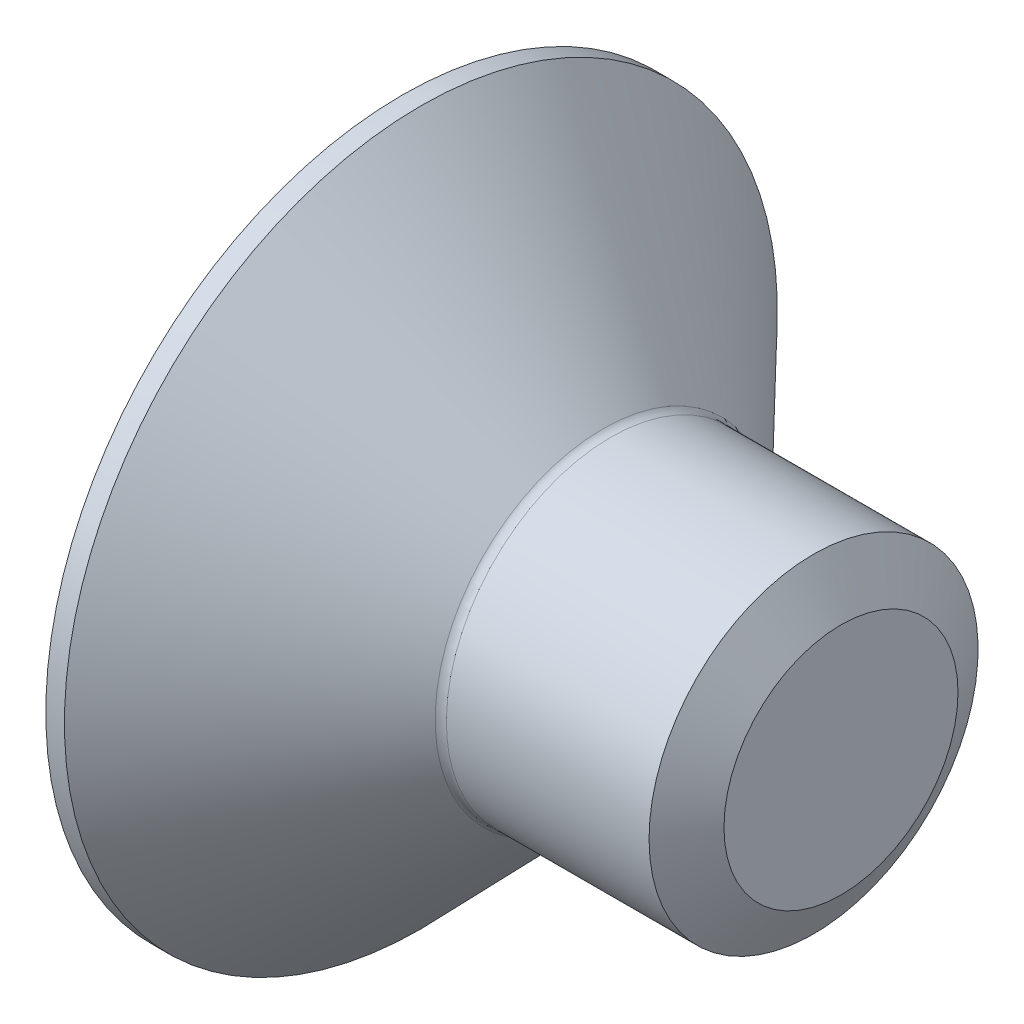
ISO-10303-21;
HEADER;
FILE_DESCRIPTION(('STEP AP214'),'2;1');
FILE_NAME('part.step','',(''),(''),'','','');
FILE_SCHEMA(('AUTOMOTIVE_DESIGN { 1 0 10303 214 1 1 1 1 }'));
ENDSEC;
DATA;
#1=APPLICATION_CONTEXT('core data for automotive mechanical design processes');
#2=APPLICATION_PROTOCOL_DEFINITION('international standard','automotive_design',2000,#1);
#3=PRODUCT_CONTEXT('',#1,'mechanical');
#4=PRODUCT('Part','Part','',(#3));
#5=PRODUCT_RELATED_PRODUCT_CATEGORY('part','',(#4));
#6=PRODUCT_DEFINITION_FORMATION('','',#4);
#7=PRODUCT_DEFINITION_CONTEXT('part definition',#1,'design');
#8=PRODUCT_DEFINITION('design','',#6,#7);
#9=PRODUCT_DEFINITION_SHAPE('','',#8);
#10=(LENGTH_UNIT() NAMED_UNIT(*) SI_UNIT(.MILLI.,.METRE.));
#11=(NAMED_UNIT(*) PLANE_ANGLE_UNIT() SI_UNIT($,.RADIAN.));
#12=(NAMED_UNIT(*) SI_UNIT($,.STERADIAN.) SOLID_ANGLE_UNIT());
#13=UNCERTAINTY_MEASURE_WITH_UNIT(LENGTH_MEASURE(1.E-05),#10,'distance_accuracy_value','');
#14=(GEOMETRIC_REPRESENTATION_CONTEXT(3) GLOBAL_UNCERTAINTY_ASSIGNED_CONTEXT((#13)) GLOBAL_UNIT_ASSIGNED_CONTEXT((#10,
#11,#12)) REPRESENTATION_CONTEXT('',''));
#15=CARTESIAN_POINT('',(0.,0.,0.));
#16=DIRECTION('',(0.,0.,1.));
#17=DIRECTION('',(1.,0.,0.));
#18=AXIS2_PLACEMENT_3D('',#15,#16,#17);
#19=CARTESIAN_POINT('',(0.,0.,0.));
#20=DIRECTION('',(1.,0.,0.));
#21=DIRECTION('',(0.,1.,0.));
#22=AXIS2_PLACEMENT_3D('',#19,#20,#21);
#23=CYLINDRICAL_SURFACE('',#22,1.5);
#24=CARTESIAN_POINT('',(-2.09755251837904,0.,0.));
#25=DIRECTION('',(1.,0.,0.));
#26=DIRECTION('',(0.,1.,0.));
#27=AXIS2_PLACEMENT_3D('',#24,#25,#26);
#28=CIRCLE('',#27,1.5);
#29=CARTESIAN_POINT('',(-2.09755251837904,1.5,0.));
#30=VERTEX_POINT('',#29);
#31=EDGE_CURVE('E123',#30,#30,#28,.T.);
#32=ORIENTED_EDGE('',*,*,#31,.T.);
#33=EDGE_LOOP('',(#32));
#34=FACE_BOUND('',#33,.T.);
#35=CARTESIAN_POINT('',(-0.25,0.,0.));
#36=DIRECTION('',(-1.,0.,0.));
#37=DIRECTION('',(0.,0.,1.));
#38=AXIS2_PLACEMENT_3D('',#35,#36,#37);
#39=CIRCLE('',#38,1.5);
#40=CARTESIAN_POINT('',(-0.25,0.,1.5));
#41=VERTEX_POINT('',#40);
#42=EDGE_CURVE('E114',#41,#41,#39,.T.);
#43=ORIENTED_EDGE('',*,*,#42,.T.);
#44=EDGE_LOOP('',(#43));
#45=FACE_BOUND('',#44,.T.);
#46=ADVANCED_FACE('F36',(#34,#45),#23,.T.);
#47=CARTESIAN_POINT('',(-4.,3.25,0.));
#48=DIRECTION('',(-1.,0.,0.));
#49=DIRECTION('',(0.,-1.,0.));
#50=AXIS2_PLACEMENT_3D('',#47,#48,#49);
#51=PLANE('',#50);
#52=CARTESIAN_POINT('',(-4.,0.,0.));
#53=DIRECTION('',(1.,0.,0.));
#54=DIRECTION('',(0.,1.,0.));
#55=AXIS2_PLACEMENT_3D('',#52,#53,#54);
#56=CIRCLE('',#55,3.25);
#57=CARTESIAN_POINT('',(-4.,3.25,0.));
#58=VERTEX_POINT('',#57);
#59=EDGE_CURVE('E206',#58,#58,#56,.T.);
#60=ORIENTED_EDGE('',*,*,#59,.F.);
#61=EDGE_LOOP('',(#60));
#62=FACE_BOUND('',#61,.T.);
#63=CARTESIAN_POINT('',(-4.,0.,0.));
#64=DIRECTION('',(-1.,0.,0.));
#65=DIRECTION('',(0.,-1.,0.));
#66=AXIS2_PLACEMENT_3D('',#63,#64,#65);
#67=CIRCLE('',#66,1.15470053837926);
#68=CARTESIAN_POINT('',(-4.,-0.577350269189633,0.999999999999996));
#69=VERTEX_POINT('',#68);
#70=CARTESIAN_POINT('',(-4.,-1.15470053837925,0.));
#71=VERTEX_POINT('',#70);
#72=EDGE_CURVE('E40',#69,#71,#67,.F.);
#73=ORIENTED_EDGE('',*,*,#72,.T.);
#74=CARTESIAN_POINT('',(-4.,-0.577350269189619,-1.));
#75=VERTEX_POINT('',#74);
#76=EDGE_CURVE('E11',#71,#75,#67,.F.);
#77=ORIENTED_EDGE('',*,*,#76,.T.);
#78=CARTESIAN_POINT('',(-4.,0.577350269189626,-1.));
#79=VERTEX_POINT('',#78);
#80=EDGE_CURVE('E45',#75,#79,#67,.F.);
#81=ORIENTED_EDGE('',*,*,#80,.T.);
#82=CARTESIAN_POINT('',(-4.,1.15470053837925,0.));
#83=VERTEX_POINT('',#82);
#84=EDGE_CURVE('E110',#79,#83,#67,.F.);
#85=ORIENTED_EDGE('',*,*,#84,.T.);
#86=CARTESIAN_POINT('',(-4.,0.,0.));
#87=DIRECTION('',(-1.,0.,0.));
#88=DIRECTION('',(0.,0.,1.));
#89=AXIS2_PLACEMENT_3D('',#86,#87,#88);
#90=CIRCLE('',#89,1.15470053837925);
#91=CARTESIAN_POINT('',(-4.,0.57735026918962,1.));
#92=VERTEX_POINT('',#91);
#93=EDGE_CURVE('E95',#92,#83,#90,.T.);
#94=ORIENTED_EDGE('',*,*,#93,.F.);
#95=EDGE_CURVE('E104',#92,#69,#67,.F.);
#96=ORIENTED_EDGE('',*,*,#95,.T.);
#97=EDGE_LOOP('',(#73,#77,#81,#85,#94,#96));
#98=FACE_BOUND('',#97,.T.);
#99=ADVANCED_FACE('F111',(#62,#98),#51,.T.);
#100=CARTESIAN_POINT('',(0.,0.,0.));
#101=DIRECTION('',(1.,0.,0.));
#102=DIRECTION('',(0.,1.,0.));
#103=AXIS2_PLACEMENT_3D('',#100,#101,#102);
#104=CYLINDRICAL_SURFACE('',#103,3.25);
#105=ORIENTED_EDGE('',*,*,#59,.T.);
#106=EDGE_LOOP('',(#105));
#107=FACE_BOUND('',#106,.T.);
#108=CARTESIAN_POINT('',(-3.82995535591237,0.,0.));
#109=DIRECTION('',(1.,0.,0.));
#110=DIRECTION('',(0.,1.,0.));
#111=AXIS2_PLACEMENT_3D('',#108,#109,#110);
#112=CIRCLE('',#111,3.25);
#113=CARTESIAN_POINT('',(-3.82995535591237,3.25,0.));
#114=VERTEX_POINT('',#113);
#115=EDGE_CURVE('E208',#114,#114,#112,.T.);
#116=ORIENTED_EDGE('',*,*,#115,.F.);
#117=EDGE_LOOP('',(#116));
#118=FACE_BOUND('',#117,.T.);
#119=ADVANCED_FACE('F196',(#107,#118),#104,.T.);
#120=CARTESIAN_POINT('',(-2.1694864984129,0.,0.));
#121=DIRECTION('',(-1.,0.,0.));
#122=DIRECTION('',(0.,-1.,0.));
#123=AXIS2_PLACEMENT_3D('',#120,#121,#122);
#124=CONICAL_SURFACE('',#123,1.5305341629541,0.802851455917393);
#125=ORIENTED_EDGE('',*,*,#115,.T.);
#126=EDGE_LOOP('',(#125));
#127=FACE_BOUND('',#126,.T.);
#128=CARTESIAN_POINT('',(-2.1694864984129,0.,0.));
#129=DIRECTION('',(1.,0.,0.));
#130=DIRECTION('',(0.,1.,0.));
#131=AXIS2_PLACEMENT_3D('',#128,#129,#130);
#132=CIRCLE('',#131,1.5305341629541);
#133=CARTESIAN_POINT('',(-2.1694864984129,1.5305341629541,0.));
#134=VERTEX_POINT('',#133);
#135=EDGE_CURVE('E212',#134,#134,#132,.T.);
#136=ORIENTED_EDGE('',*,*,#135,.F.);
#137=EDGE_LOOP('',(#136));
#138=FACE_BOUND('',#137,.T.);
#139=ADVANCED_FACE('F192',(#127,#138),#124,.T.);
#140=CARTESIAN_POINT('',(-2.09755251837904,0.,0.));
#141=DIRECTION('',(1.,0.,0.));
#142=DIRECTION('',(0.,1.,0.));
#143=AXIS2_PLACEMENT_3D('',#140,#141,#142);
#144=TOROIDAL_SURFACE('',#143,1.6,0.1);
#145=ORIENTED_EDGE('',*,*,#135,.T.);
#146=EDGE_LOOP('',(#145));
#147=FACE_BOUND('',#146,.T.);
#148=ORIENTED_EDGE('',*,*,#31,.F.);
#149=EDGE_LOOP('',(#148));
#150=FACE_BOUND('',#149,.T.);
#151=ADVANCED_FACE('F188',(#147,#150),#144,.F.);
#152=CARTESIAN_POINT('',(-3.67,0.,0.));
#153=DIRECTION('',(-1.,0.,0.));
#154=DIRECTION('',(0.,0.,1.));
#155=AXIS2_PLACEMENT_3D('',#152,#153,#154);
#156=CONICAL_SURFACE('',#155,0.,1.2924281638629);
#157=CARTESIAN_POINT('',(-4.0000330049495,-0.577234799135788,1.0002));
#158=CARTESIAN_POINT('',(-3.99317677231321,-0.601209328784403,0.958674896561032));
#159=CARTESIAN_POINT('',(-3.986950249306,-0.625233209733956,0.917064314161421));
#160=CARTESIAN_POINT('',(-3.97600820198551,-0.673377505205147,0.83367594831071));
#161=CARTESIAN_POINT('',(-3.97129338172424,-0.697497959424798,0.791898096100636));
#162=CARTESIAN_POINT('',(-3.9636556441477,-0.745669161891495,0.70846312596663));
#163=CARTESIAN_POINT('',(-3.96072237456089,-0.769719488656232,0.66680673807147));
#164=CARTESIAN_POINT('',(-3.95678895886859,-0.817855017501817,0.583433556461721));
#165=CARTESIAN_POINT('',(-3.95578838324886,-0.841940210643128,0.54171677823086));
#166=CARTESIAN_POINT('',(-3.95578838324886,-0.890110596925751,0.458283221769139));
#167=CARTESIAN_POINT('',(-3.95678895886859,-0.914195790067062,0.416566443538279));
#168=CARTESIAN_POINT('',(-3.96072237456089,-0.962331318912646,0.333193261928529));
#169=CARTESIAN_POINT('',(-3.9636556441477,-0.986381645677384,0.29153687403337));
#170=CARTESIAN_POINT('',(-3.97129338172424,-1.03455284814408,0.208101903899364));
#171=CARTESIAN_POINT('',(-3.97600820198551,-1.05867330236373,0.166324051689289));
#172=CARTESIAN_POINT('',(-3.986950249306,-1.10681759783492,0.0829356858385786));
#173=CARTESIAN_POINT('',(-3.9931767723132,-1.13084147878447,0.0413251034389671));
#174=CARTESIAN_POINT('',(-4.0000330049495,-1.15481600843309,-0.000200000000000163));
#175=B_SPLINE_CURVE_WITH_KNOTS('',3,(#157,#158,#159,#160,#161,#162,#163,#164,#165,#166,#167,
#168,#169,#170,#171,#172,#173,#174),.UNSPECIFIED.,.F.,.F.,(4,2,2,2,2,2,2,2,4),(0.,
0.145319064827825,0.290705711767534,0.435239252261502,0.579740668498364,0.724242084735225,
0.868775625229193,1.0141622721689,1.15948133699673),.UNSPECIFIED.);
#176=EDGE_CURVE('E129',#69,#71,#175,.T.);
#177=ORIENTED_EDGE('',*,*,#176,.T.);
#178=ORIENTED_EDGE('',*,*,#72,.F.);
#179=EDGE_LOOP('',(#177,#178));
#180=FACE_BOUND('',#179,.T.);
#181=ADVANCED_FACE('F191',(#180),#156,.F.);
#182=CARTESIAN_POINT('',(-4.18642012479891,-1.50507658562174,1.));
#183=CARTESIAN_POINT('',(-4.17568053389836,-1.45995191683151,1.));
#184=CARTESIAN_POINT('',(-4.1650772555009,-1.41479478404147,1.));
#185=CARTESIAN_POINT('',(-4.14421246509078,-1.32439927872502,1.));
#186=CARTESIAN_POINT('',(-4.13395097066938,-1.27916090214299,1.));
#187=CARTESIAN_POINT('',(-4.10376110485824,-1.14320091952673,1.));
#188=CARTESIAN_POINT('',(-4.08445269282589,-1.0523395057026,1.));
#189=CARTESIAN_POINT('',(-4.0485427680109,-0.871021733651419,1.));
#190=CARTESIAN_POINT('',(-4.03191600726561,-0.780570478060274,1.));
#191=CARTESIAN_POINT('',(-4.00245938977244,-0.599053834032337,1.));
#192=CARTESIAN_POINT('',(-3.98962864404707,-0.507988594500085,1.));
#193=CARTESIAN_POINT('',(-3.96943375174607,-0.32401701013366,1.));
#194=CARTESIAN_POINT('',(-3.96214218519738,-0.231102062710143,1.));
#195=CARTESIAN_POINT('',(-3.95667782512395,-0.0915430747170623,1.));
#196=CARTESIAN_POINT('',(-3.9557682159605,-0.0450005144934814,1.));
#197=CARTESIAN_POINT('',(-3.95580922979905,0.0480838901527622,1.));
#198=CARTESIAN_POINT('',(-3.95675985710569,0.0946257345735194,1.));
#199=CARTESIAN_POINT('',(-3.96235911230975,0.234573783926051,1.));
#200=CARTESIAN_POINT('',(-3.96977149970246,0.327875024932963,1.));
#201=CARTESIAN_POINT('',(-3.99036481799359,0.513866327853431,1.));
#202=CARTESIAN_POINT('',(-4.00355054731467,0.60655581613127,1.));
#203=CARTESIAN_POINT('',(-4.03433027338347,0.7945597970276,1.));
#204=CARTESIAN_POINT('',(-4.05206417336317,0.889850634542145,1.));
#205=CARTESIAN_POINT('',(-4.09017928884159,1.07990716554416,1.));
#206=CARTESIAN_POINT('',(-4.11056098996145,1.17467275936659,1.));
#207=CARTESIAN_POINT('',(-4.15303020702755,1.36384761434311,1.));
#208=CARTESIAN_POINT('',(-4.17511824931273,1.45825675605089,1.));
#209=CARTESIAN_POINT('',(-4.22042048843015,1.64680497415505,1.));
#210=CARTESIAN_POINT('',(-4.24363471263918,1.74094404392717,1.));
#211=CARTESIAN_POINT('',(-4.29049807328423,1.92768913293957,1.));
#212=CARTESIAN_POINT('',(-4.31413631318398,2.02029789764918,1.));
#213=CARTESIAN_POINT('',(-4.36194659114886,2.20537976707471,1.));
#214=CARTESIAN_POINT('',(-4.38611864310246,2.2978528681941,1.));
#215=CARTESIAN_POINT('',(-4.43481362957481,2.48255351818147,1.));
#216=CARTESIAN_POINT('',(-4.45933596375947,2.57478122564271,1.));
#217=CARTESIAN_POINT('',(-4.50867632184139,2.7591535456386,1.));
#218=CARTESIAN_POINT('',(-4.53349433367616,2.8512981613992,1.));
#219=CARTESIAN_POINT('',(-4.55841535287488,2.94341459729474,1.));
#220=B_SPLINE_CURVE_WITH_KNOTS('',3,(#182,#183,#184,#185,#186,#187,#188,#189,#190,#191,#192,
#193,#194,#195,#196,#197,#198,#199,#200,#201,#202,#203,#204,#205,#206,#207,#208,#209,#210,#211,
#212,#213,#214,#215,#216,#217,#218,#219),.UNSPECIFIED.,.F.,.F.,(4,2,2,2,2,2,2,2,2,2,2,2,2,2,2,2,
2,2,4),(0.,0.139154753232828,0.278316657587893,0.556964604480121,0.83281288176632,
1.10859650773445,1.38793420964474,1.52755398880046,1.66717409104072,1.94769382621527,
2.22844715485888,2.519169414303,2.80994506926728,3.10081077796332,3.39168356097394,
3.67841536084619,3.96515462957441,4.25145053495921,4.53773480030589),.UNSPECIFIED.);
#221=EDGE_CURVE('E100',#92,#69,#220,.F.);
#222=ORIENTED_EDGE('',*,*,#221,.T.);
#223=ORIENTED_EDGE('',*,*,#95,.F.);
#224=EDGE_LOOP('',(#222,#223));
#225=FACE_BOUND('',#224,.T.);
#226=ADVANCED_FACE('F105',(#225),#156,.F.);
#227=CARTESIAN_POINT('',(-4.0000330049495,1.15481600843309,-0.000199999999999794));
#228=CARTESIAN_POINT('',(-3.9931767723132,1.13084147878447,0.0413251034389676));
#229=CARTESIAN_POINT('',(-3.986950249306,1.10681759783492,0.082935685838579));
#230=CARTESIAN_POINT('',(-3.97600820198551,1.05867330236373,0.166324051689289));
#231=CARTESIAN_POINT('',(-3.97129338172424,1.03455284814408,0.208101903899364));
#232=CARTESIAN_POINT('',(-3.9636556441477,0.986381645677383,0.29153687403337));
#233=CARTESIAN_POINT('',(-3.96072237456089,0.962331318912645,0.33319326192853));
#234=CARTESIAN_POINT('',(-3.95678895886859,0.914195790067061,0.416566443538279));
#235=CARTESIAN_POINT('',(-3.95578838324886,0.89011059692575,0.45828322176914));
#236=CARTESIAN_POINT('',(-3.95578838324886,0.841940210643127,0.54171677823086));
#237=CARTESIAN_POINT('',(-3.95678895886859,0.817855017501816,0.583433556461721));
#238=CARTESIAN_POINT('',(-3.96072237456089,0.769719488656232,0.66680673807147));
#239=CARTESIAN_POINT('',(-3.9636556441477,0.745669161891494,0.70846312596663));
#240=CARTESIAN_POINT('',(-3.97129338172424,0.697497959424797,0.791898096100636));
#241=CARTESIAN_POINT('',(-3.97600820198551,0.673377505205146,0.83367594831071));
#242=CARTESIAN_POINT('',(-3.986950249306,0.625233209733955,0.917064314161421));
#243=CARTESIAN_POINT('',(-3.99317677231321,0.601209328784402,0.958674896561032));
#244=CARTESIAN_POINT('',(-4.0000330049495,0.577234799135788,1.0002));
#245=B_SPLINE_CURVE_WITH_KNOTS('',3,(#227,#228,#229,#230,#231,#232,#233,#234,#235,#236,#237,
#238,#239,#240,#241,#242,#243,#244),.UNSPECIFIED.,.F.,.F.,(4,2,2,2,2,2,2,2,4),(0.,
0.145319064827825,0.290705711767534,0.435239252261502,0.579740668498363,0.724242084735225,
0.868775625229193,1.0141622721689,1.15948133699673),.UNSPECIFIED.);
#246=EDGE_CURVE('E91',#83,#92,#245,.T.);
#247=ORIENTED_EDGE('',*,*,#246,.T.);
#248=ORIENTED_EDGE('',*,*,#93,.T.);
#249=EDGE_LOOP('',(#247,#248));
#250=FACE_BOUND('',#249,.T.);
#251=ADVANCED_FACE('F93',(#250),#156,.F.);
#252=CARTESIAN_POINT('',(-4.0000330049495,0.577234799135788,-1.0002));
#253=CARTESIAN_POINT('',(-3.9931767723132,0.601209328784402,-0.958674896561033));
#254=CARTESIAN_POINT('',(-3.986950249306,0.625233209733955,-0.917064314161421));
#255=CARTESIAN_POINT('',(-3.97600820198551,0.673377505205146,-0.83367594831071));
#256=CARTESIAN_POINT('',(-3.97129338172424,0.697497959424797,-0.791898096100636));
#257=CARTESIAN_POINT('',(-3.9636556441477,0.745669161891494,-0.70846312596663));
#258=CARTESIAN_POINT('',(-3.96072237456089,0.769719488656232,-0.66680673807147));
#259=CARTESIAN_POINT('',(-3.95678895886859,0.817855017501816,-0.583433556461721));
#260=CARTESIAN_POINT('',(-3.95578838324886,0.841940210643127,-0.54171677823086));
#261=CARTESIAN_POINT('',(-3.95578838324886,0.890110596925749,-0.458283221769139));
#262=CARTESIAN_POINT('',(-3.95678895886859,0.914195790067061,-0.416566443538279));
#263=CARTESIAN_POINT('',(-3.96072237456089,0.962331318912645,-0.333193261928529));
#264=CARTESIAN_POINT('',(-3.9636556441477,0.986381645677383,-0.29153687403337));
#265=CARTESIAN_POINT('',(-3.97129338172424,1.03455284814408,-0.208101903899363));
#266=CARTESIAN_POINT('',(-3.97600820198551,1.05867330236373,-0.166324051689289));
#267=CARTESIAN_POINT('',(-3.986950249306,1.10681759783492,-0.0829356858385785));
#268=CARTESIAN_POINT('',(-3.9931767723132,1.13084147878447,-0.041325103438967));
#269=CARTESIAN_POINT('',(-4.0000330049495,1.15481600843309,0.000200000000000296));
#270=B_SPLINE_CURVE_WITH_KNOTS('',3,(#252,#253,#254,#255,#256,#257,#258,#259,#260,#261,#262,
#263,#264,#265,#266,#267,#268,#269),.UNSPECIFIED.,.F.,.F.,(4,2,2,2,2,2,2,2,4),(0.,
0.145319064827825,0.290705711767534,0.435239252261503,0.579740668498364,0.724242084735225,
0.868775625229193,1.0141622721689,1.15948133699673),.UNSPECIFIED.);
#271=EDGE_CURVE('E113',#79,#83,#270,.T.);
#272=ORIENTED_EDGE('',*,*,#271,.T.);
#273=ORIENTED_EDGE('',*,*,#84,.F.);
#274=EDGE_LOOP('',(#272,#273));
#275=FACE_BOUND('',#274,.T.);
#276=ADVANCED_FACE('F282',(#275),#156,.F.);
#277=CARTESIAN_POINT('',(-4.18642012479891,-1.50507658562174,-1.));
#278=CARTESIAN_POINT('',(-4.17568053389836,-1.45995191683151,-1.));
#279=CARTESIAN_POINT('',(-4.1650772555009,-1.41479478404147,-1.));
#280=CARTESIAN_POINT('',(-4.14421246509078,-1.32439927872502,-1.));
#281=CARTESIAN_POINT('',(-4.13395097066938,-1.27916090214299,-1.));
#282=CARTESIAN_POINT('',(-4.10376110485824,-1.14320091952673,-1.));
#283=CARTESIAN_POINT('',(-4.08445269282589,-1.0523395057026,-1.));
#284=CARTESIAN_POINT('',(-4.0485427680109,-0.871021733651419,-1.));
#285=CARTESIAN_POINT('',(-4.03191600726561,-0.780570478060274,-1.));
#286=CARTESIAN_POINT('',(-4.00245938977244,-0.599053834032337,-1.));
#287=CARTESIAN_POINT('',(-3.98962864404707,-0.507988594500085,-1.));
#288=CARTESIAN_POINT('',(-3.96943375174607,-0.32401701013366,-1.));
#289=CARTESIAN_POINT('',(-3.96214218519738,-0.231102062710142,-1.));
#290=CARTESIAN_POINT('',(-3.95667782512395,-0.091543074717062,-1.));
#291=CARTESIAN_POINT('',(-3.9557682159605,-0.0450005144934812,-1.));
#292=CARTESIAN_POINT('',(-3.95580922979905,0.0480838901527625,-1.));
#293=CARTESIAN_POINT('',(-3.95675985710569,0.0946257345735197,-1.));
#294=CARTESIAN_POINT('',(-3.96235911230975,0.234573783926051,-1.));
#295=CARTESIAN_POINT('',(-3.96977149970246,0.327875024932964,-1.));
#296=CARTESIAN_POINT('',(-3.99036481799359,0.513866327853432,-1.));
#297=CARTESIAN_POINT('',(-4.00355054731467,0.606555816131271,-1.));
#298=CARTESIAN_POINT('',(-4.03433027338347,0.7945597970276,-1.));
#299=CARTESIAN_POINT('',(-4.05206417336317,0.889850634542145,-1.));
#300=CARTESIAN_POINT('',(-4.09017928884159,1.07990716554416,-1.));
#301=CARTESIAN_POINT('',(-4.11056098996145,1.17467275936659,-1.));
#302=CARTESIAN_POINT('',(-4.15303020702755,1.36384761434311,-1.));
#303=CARTESIAN_POINT('',(-4.17511824931273,1.45825675605089,-1.));
#304=CARTESIAN_POINT('',(-4.22042048843015,1.64680497415505,-1.));
#305=CARTESIAN_POINT('',(-4.24363471263918,1.74094404392717,-1.));
#306=CARTESIAN_POINT('',(-4.29049807328423,1.92768913293957,-1.));
#307=CARTESIAN_POINT('',(-4.31413631318398,2.02029789764918,-1.));
#308=CARTESIAN_POINT('',(-4.36194659114886,2.20537976707471,-1.));
#309=CARTESIAN_POINT('',(-4.38611864310246,2.2978528681941,-1.));
#310=CARTESIAN_POINT('',(-4.43481362957481,2.48255351818147,-1.));
#311=CARTESIAN_POINT('',(-4.45933596375947,2.57478122564271,-1.));
#312=CARTESIAN_POINT('',(-4.50867632184139,2.75915354563859,-1.));
#313=CARTESIAN_POINT('',(-4.53349433367616,2.8512981613992,-1.));
#314=CARTESIAN_POINT('',(-4.55841535287488,2.94341459729474,-1.));
#315=B_SPLINE_CURVE_WITH_KNOTS('',3,(#277,#278,#279,#280,#281,#282,#283,#284,#285,#286,#287,
#288,#289,#290,#291,#292,#293,#294,#295,#296,#297,#298,#299,#300,#301,#302,#303,#304,#305,#306,
#307,#308,#309,#310,#311,#312,#313,#314),.UNSPECIFIED.,.F.,.F.,(4,2,2,2,2,2,2,2,2,2,2,2,2,2,2,2,
2,2,4),(0.,0.139154753232828,0.278316657587893,0.556964604480121,0.83281288176632,
1.10859650773445,1.38793420964474,1.52755398880046,1.66717409104072,1.94769382621527,
2.22844715485888,2.519169414303,2.80994506926728,3.10081077796332,3.39168356097394,
3.67841536084619,3.96515462957441,4.25145053495921,4.53773480030589),.UNSPECIFIED.);
#316=EDGE_CURVE('E241',#75,#79,#315,.T.);
#317=ORIENTED_EDGE('',*,*,#316,.T.);
#318=ORIENTED_EDGE('',*,*,#80,.F.);
#319=EDGE_LOOP('',(#317,#318));
#320=FACE_BOUND('',#319,.T.);
#321=ADVANCED_FACE('F269',(#320),#156,.F.);
#322=CARTESIAN_POINT('',(-4.0000330049495,-1.15481600843309,0.000199999999999856));
#323=CARTESIAN_POINT('',(-3.9931767723132,-1.13084147878447,-0.0413251034389675));
#324=CARTESIAN_POINT('',(-3.986950249306,-1.10681759783492,-0.082935685838579));
#325=CARTESIAN_POINT('',(-3.97600820198551,-1.05867330236373,-0.166324051689289));
#326=CARTESIAN_POINT('',(-3.97129338172424,-1.03455284814408,-0.208101903899364));
#327=CARTESIAN_POINT('',(-3.9636556441477,-0.986381645677384,-0.29153687403337));
#328=CARTESIAN_POINT('',(-3.96072237456089,-0.962331318912646,-0.33319326192853));
#329=CARTESIAN_POINT('',(-3.95678895886859,-0.914195790067061,-0.416566443538279));
#330=CARTESIAN_POINT('',(-3.95578838324886,-0.89011059692575,-0.45828322176914));
#331=CARTESIAN_POINT('',(-3.95578838324886,-0.841940210643128,-0.54171677823086));
#332=CARTESIAN_POINT('',(-3.95678895886859,-0.817855017501817,-0.583433556461721));
#333=CARTESIAN_POINT('',(-3.96072237456089,-0.769719488656232,-0.66680673807147));
#334=CARTESIAN_POINT('',(-3.9636556441477,-0.745669161891494,-0.70846312596663));
#335=CARTESIAN_POINT('',(-3.97129338172424,-0.697497959424797,-0.791898096100636));
#336=CARTESIAN_POINT('',(-3.97600820198551,-0.673377505205147,-0.833675948310711));
#337=CARTESIAN_POINT('',(-3.986950249306,-0.625233209733956,-0.917064314161421));
#338=CARTESIAN_POINT('',(-3.9931767723132,-0.601209328784403,-0.958674896561033));
#339=CARTESIAN_POINT('',(-4.0000330049495,-0.577234799135788,-1.0002));
#340=B_SPLINE_CURVE_WITH_KNOTS('',3,(#322,#323,#324,#325,#326,#327,#328,#329,#330,#331,#332,
#333,#334,#335,#336,#337,#338,#339),.UNSPECIFIED.,.F.,.F.,(4,2,2,2,2,2,2,2,4),(0.,
0.145319064827825,0.290705711767534,0.435239252261502,0.579740668498364,0.724242084735225,
0.868775625229193,1.0141622721689,1.15948133699673),.UNSPECIFIED.);
#341=EDGE_CURVE('E131',#71,#75,#340,.T.);
#342=ORIENTED_EDGE('',*,*,#341,.T.);
#343=ORIENTED_EDGE('',*,*,#76,.F.);
#344=EDGE_LOOP('',(#342,#343));
#345=FACE_BOUND('',#344,.T.);
#346=ADVANCED_FACE('F272',(#345),#156,.F.);
#347=CARTESIAN_POINT('',(-2.9,0.,0.));
#348=DIRECTION('',(-1.,0.,0.));
#349=DIRECTION('',(0.,0.,1.));
#350=AXIS2_PLACEMENT_3D('',#347,#348,#349);
#351=CONICAL_SURFACE('',#350,1.15470053837925,1.0471975511966);
#352=CARTESIAN_POINT('',(-2.23333333333334,0.,0.));
#353=VERTEX_POINT('',#352);
#354=VERTEX_LOOP('',#353);
#355=FACE_BOUND('',#354,.T.);
#356=CARTESIAN_POINT('',(-3.27183528873946,-1.49514512143374,1.));
#357=CARTESIAN_POINT('',(-3.25111502079343,-1.4519612611533,1.));
#358=CARTESIAN_POINT('',(-3.23061367234946,-1.40867282404236,1.));
#359=CARTESIAN_POINT('',(-3.1901634335246,-1.32182947914248,1.));
#360=CARTESIAN_POINT('',(-3.17021464256729,-1.27827452509756,1.));
#361=CARTESIAN_POINT('',(-3.11114515483648,-1.14662339890625,1.));
#362=CARTESIAN_POINT('',(-3.07305252653304,-1.05805724149108,1.));
#363=CARTESIAN_POINT('',(-3.00024582070057,-0.876833003172497,1.));
#364=CARTESIAN_POINT('',(-2.96564584045392,-0.784128452056495,1.));
#365=CARTESIAN_POINT('',(-2.90407347381845,-0.596331746532131,1.));
#366=CARTESIAN_POINT('',(-2.87708128484785,-0.501246505541256,1.));
#367=CARTESIAN_POINT('',(-2.84577577003502,-0.356699986452703,1.));
#368=CARTESIAN_POINT('',(-2.83687509854699,-0.308244163171709,1.));
#369=CARTESIAN_POINT('',(-2.82274243175691,-0.210788870695443,1.));
#370=CARTESIAN_POINT('',(-2.81751018853518,-0.161789438465742,1.));
#371=CARTESIAN_POINT('',(-2.81119898098177,-0.0641060489970661,1.));
#372=CARTESIAN_POINT('',(-2.8100710050111,-0.015425346126977,1.));
#373=CARTESIAN_POINT('',(-2.81193297830514,0.0818553564032753,1.));
#374=CARTESIAN_POINT('',(-2.81492318255361,0.130455350879702,1.));
#375=CARTESIAN_POINT('',(-2.8271183217293,0.250369589613778,1.));
#376=CARTESIAN_POINT('',(-2.83860856098489,0.321451919115028,1.));
#377=CARTESIAN_POINT('',(-2.86824031739763,0.462229038490168,1.));
#378=CARTESIAN_POINT('',(-2.88638985094493,0.531922048861734,1.));
#379=CARTESIAN_POINT('',(-2.92786972268664,0.671415729806807,1.));
#380=CARTESIAN_POINT('',(-2.95130716830693,0.741183729418072,1.));
#381=CARTESIAN_POINT('',(-3.00156448824641,0.87943831939629,1.));
#382=CARTESIAN_POINT('',(-3.02838317523047,0.947925349932562,1.));
#383=CARTESIAN_POINT('',(-3.10005391547339,1.12214515906645,1.));
#384=CARTESIAN_POINT('',(-3.14657230519898,1.22718574040678,1.));
#385=CARTESIAN_POINT('',(-3.24287692224798,1.43575968104558,1.));
#386=CARTESIAN_POINT('',(-3.29266398782223,1.53929264533348,1.));
#387=CARTESIAN_POINT('',(-3.39433644453463,1.74546702338822,1.));
#388=CARTESIAN_POINT('',(-3.44622418186697,1.84810727553999,1.));
#389=CARTESIAN_POINT('',(-3.55133836883522,2.05270058021726,1.));
#390=CARTESIAN_POINT('',(-3.60456486267233,2.15465360991172,1.));
#391=CARTESIAN_POINT('',(-3.7068669169112,2.34846553091283,1.));
#392=CARTESIAN_POINT('',(-3.75585965896403,2.44036823161571,1.));
#393=CARTESIAN_POINT('',(-3.8544031328282,2.623877990053,1.));
#394=CARTESIAN_POINT('',(-3.90395388528948,2.71548503668387,1.));
#395=CARTESIAN_POINT('',(-4.00334710767982,2.89823865557593,1.));
#396=CARTESIAN_POINT('',(-4.053188515041,2.98938580641155,1.));
#397=CARTESIAN_POINT('',(-4.15319572337611,3.17149583112622,1.));
#398=CARTESIAN_POINT('',(-4.20336150723714,3.26245871439935,1.));
#399=CARTESIAN_POINT('',(-4.25364621220496,3.35335539208176,1.));
#400=B_SPLINE_CURVE_WITH_KNOTS('',3,(#356,#357,#358,#359,#360,#361,#362,#363,#364,#365,#366,
#367,#368,#369,#370,#371,#372,#373,#374,#375,#376,#377,#378,#379,#380,#381,#382,#383,#384,#385,
#386,#387,#388,#389,#390,#391,#392,#393,#394,#395,#396,#397,#398,#399),.UNSPECIFIED.,.F.,.F.,(4,
2,2,2,2,2,2,2,2,2,2,2,2,2,2,2,2,2,2,2,2,4),(0.,0.143690341820649,0.287406372566272,
0.576560332877491,0.873259488934031,1.16917907000006,1.31686338831957,1.46453772487642,
1.61044269221659,1.75635669390452,1.97192533331898,2.18775432802313,2.40842600301165,
2.62902040304935,2.97355048126458,3.31816926186283,3.66318417395131,4.00821049225242,
4.32064609598596,4.63309330006988,4.9447457824876,5.2563819552864),.UNSPECIFIED.);
#401=CARTESIAN_POINT('',(-2.9,-0.577350269189626,1.));
#402=VERTEX_POINT('',#401);
#403=CARTESIAN_POINT('',(-2.9,0.577350269189626,1.));
#404=VERTEX_POINT('',#403);
#405=EDGE_CURVE('E160',#402,#404,#400,.T.);
#406=ORIENTED_EDGE('',*,*,#405,.T.);
#407=CARTESIAN_POINT('',(-2.90006667666566,0.577234799135788,1.0002));
#408=CARTESIAN_POINT('',(-2.88540897364914,0.602607795820547,0.95625268060172));
#409=CARTESIAN_POINT('',(-2.87207772362089,0.628199807531657,0.911926016050179));
#410=CARTESIAN_POINT('',(-2.84880650762345,0.679827098330831,0.822504925328878));
#411=CARTESIAN_POINT('',(-2.83887477654978,0.705863295614158,0.777408908798268));
#412=CARTESIAN_POINT('',(-2.82341269488208,0.757612978088367,0.687775829477381));
#413=CARTESIAN_POINT('',(-2.81777946809895,0.783318495222183,0.64325256776678));
#414=CARTESIAN_POINT('',(-2.81105128864025,0.834850648373671,0.553996260284983));
#415=CARTESIAN_POINT('',(-2.80995076792166,0.860677096749781,0.509263539518505));
#416=CARTESIAN_POINT('',(-2.81222505229814,0.908946264126689,0.425658889182653));
#417=CARTESIAN_POINT('',(-2.81504143886341,0.931396163287557,0.386774523211234));
#418=CARTESIAN_POINT('',(-2.82397245021735,0.976149681982093,0.309259155014814));
#419=CARTESIAN_POINT('',(-2.8300901337543,0.998453146411451,0.270628421438361));
#420=CARTESIAN_POINT('',(-2.84538572572582,1.04329913914046,0.192952883515855));
#421=CARTESIAN_POINT('',(-2.85462855216896,1.0658359836813,0.153917923728832));
#422=CARTESIAN_POINT('',(-2.87560684575553,1.11057330008463,0.076430618723988));
#423=CARTESIAN_POINT('',(-2.88733737513366,1.13277434629517,0.0379772787061408));
#424=CARTESIAN_POINT('',(-2.90006667666566,1.15481600843309,-0.000199999999999799));
#425=B_SPLINE_CURVE_WITH_KNOTS('',3,(#407,#408,#409,#410,#411,#412,#413,#414,#415,#416,#417,
#418,#419,#420,#421,#422,#423,#424),.UNSPECIFIED.,.F.,.F.,(4,2,2,2,2,2,2,2,4),(0.,
0.158523820030115,0.317428970089342,0.472400167924633,0.627180939971648,0.762016584872711,
0.896977373984233,1.03493410168667,1.17261952416172),.UNSPECIFIED.);
#426=CARTESIAN_POINT('',(-2.9,1.15470053837925,0.));
#427=VERTEX_POINT('',#426);
#428=EDGE_CURVE('E120',#404,#427,#425,.T.);
#429=ORIENTED_EDGE('',*,*,#428,.T.);
#430=CARTESIAN_POINT('',(-2.90006667666566,1.15481600843309,0.000200000000000246));
#431=CARTESIAN_POINT('',(-2.88540897364914,1.12944301174833,-0.0437473193982797));
#432=CARTESIAN_POINT('',(-2.87207772362089,1.10385100003722,-0.08807398394982));
#433=CARTESIAN_POINT('',(-2.84880650762345,1.05222370923805,-0.177495074671122));
#434=CARTESIAN_POINT('',(-2.83887477654978,1.02618751195472,-0.222591091201731));
#435=CARTESIAN_POINT('',(-2.82341269488208,0.97443782948051,-0.312224170522618));
#436=CARTESIAN_POINT('',(-2.81777946809895,0.948732312346694,-0.356747432233219));
#437=CARTESIAN_POINT('',(-2.81105128864025,0.897200159195206,-0.446003739715017));
#438=CARTESIAN_POINT('',(-2.80995076792166,0.871373710819097,-0.490736460481494));
#439=CARTESIAN_POINT('',(-2.81222505229814,0.823104543442188,-0.574341110817346));
#440=CARTESIAN_POINT('',(-2.81504143886341,0.800654644281321,-0.613225476788766));
#441=CARTESIAN_POINT('',(-2.82397245021735,0.755901125586785,-0.690740844985186));
#442=CARTESIAN_POINT('',(-2.8300901337543,0.733597661157427,-0.729371578561639));
#443=CARTESIAN_POINT('',(-2.84538572572582,0.688751668428419,-0.807047116484145));
#444=CARTESIAN_POINT('',(-2.85462855216896,0.666214823887575,-0.846082076271167));
#445=CARTESIAN_POINT('',(-2.87560684575553,0.62147750748425,-0.923569381276012));
#446=CARTESIAN_POINT('',(-2.88733737513366,0.599276461273706,-0.962022721293859));
#447=CARTESIAN_POINT('',(-2.90006667666566,0.577234799135788,-1.0002));
#448=B_SPLINE_CURVE_WITH_KNOTS('',3,(#430,#431,#432,#433,#434,#435,#436,#437,#438,#439,#440,
#441,#442,#443,#444,#445,#446,#447),.UNSPECIFIED.,.F.,.F.,(4,2,2,2,2,2,2,2,4),(0.,
0.158523820030115,0.317428970089342,0.472400167924633,0.627180939971648,0.762016584872711,
0.896977373984233,1.03493410168667,1.17261952416172),.UNSPECIFIED.);
#449=CARTESIAN_POINT('',(-2.9,0.577350269189626,-1.));
#450=VERTEX_POINT('',#449);
#451=EDGE_CURVE('E207',#427,#450,#448,.T.);
#452=ORIENTED_EDGE('',*,*,#451,.T.);
#453=CARTESIAN_POINT('',(-3.27183528873946,-1.49514512143374,-1.));
#454=CARTESIAN_POINT('',(-3.25111502079343,-1.4519612611533,-1.));
#455=CARTESIAN_POINT('',(-3.23061367234946,-1.40867282404236,-1.));
#456=CARTESIAN_POINT('',(-3.1901634335246,-1.32182947914248,-1.));
#457=CARTESIAN_POINT('',(-3.17021464256729,-1.27827452509756,-1.));
#458=CARTESIAN_POINT('',(-3.11114515483648,-1.14662339890625,-1.));
#459=CARTESIAN_POINT('',(-3.07305252653304,-1.05805724149108,-1.));
#460=CARTESIAN_POINT('',(-3.00024582070057,-0.876833003172497,-1.));
#461=CARTESIAN_POINT('',(-2.96564584045392,-0.784128452056496,-1.));
#462=CARTESIAN_POINT('',(-2.90407347381845,-0.596331746532131,-1.));
#463=CARTESIAN_POINT('',(-2.87708128484785,-0.501246505541256,-1.));
#464=CARTESIAN_POINT('',(-2.84577577003502,-0.356699986452703,-1.));
#465=CARTESIAN_POINT('',(-2.83687509854699,-0.308244163171709,-1.));
#466=CARTESIAN_POINT('',(-2.82274243175691,-0.210788870695442,-1.));
#467=CARTESIAN_POINT('',(-2.81751018853518,-0.161789438465742,-1.));
#468=CARTESIAN_POINT('',(-2.81119898098177,-0.0641060489970657,-1.));
#469=CARTESIAN_POINT('',(-2.8100710050111,-0.0154253461269766,-1.));
#470=CARTESIAN_POINT('',(-2.81193297830514,0.0818553564032757,-1.));
#471=CARTESIAN_POINT('',(-2.81492318255361,0.130455350879702,-1.));
#472=CARTESIAN_POINT('',(-2.8271183217293,0.250369589613778,-1.));
#473=CARTESIAN_POINT('',(-2.83860856098489,0.321451919115028,-1.));
#474=CARTESIAN_POINT('',(-2.86824031739763,0.462229038490168,-1.));
#475=CARTESIAN_POINT('',(-2.88638985094493,0.531922048861733,-1.));
#476=CARTESIAN_POINT('',(-2.92786972268664,0.671415729806807,-1.));
#477=CARTESIAN_POINT('',(-2.95130716830693,0.741183729418072,-1.));
#478=CARTESIAN_POINT('',(-3.00156448824641,0.87943831939629,-1.));
#479=CARTESIAN_POINT('',(-3.02838317523047,0.947925349932562,-1.));
#480=CARTESIAN_POINT('',(-3.10005391547339,1.12214515906645,-1.));
#481=CARTESIAN_POINT('',(-3.14657230519898,1.22718574040678,-1.));
#482=CARTESIAN_POINT('',(-3.24287692224798,1.43575968104558,-1.));
#483=CARTESIAN_POINT('',(-3.29266398782223,1.53929264533348,-1.));
#484=CARTESIAN_POINT('',(-3.39433644453463,1.74546702338822,-1.));
#485=CARTESIAN_POINT('',(-3.44622418186697,1.84810727553999,-1.));
#486=CARTESIAN_POINT('',(-3.55133836883522,2.05270058021726,-1.));
#487=CARTESIAN_POINT('',(-3.60456486267233,2.15465360991173,-1.));
#488=CARTESIAN_POINT('',(-3.7068669169112,2.34846553091283,-1.));
#489=CARTESIAN_POINT('',(-3.75585965896403,2.44036823161571,-1.));
#490=CARTESIAN_POINT('',(-3.85440313282821,2.623877990053,-1.));
#491=CARTESIAN_POINT('',(-3.90395388528948,2.71548503668387,-1.));
#492=CARTESIAN_POINT('',(-4.00334710767982,2.89823865557593,-1.));
#493=CARTESIAN_POINT('',(-4.053188515041,2.98938580641155,-1.));
#494=CARTESIAN_POINT('',(-4.15319572337612,3.17149583112622,-1.));
#495=CARTESIAN_POINT('',(-4.20336150723714,3.26245871439935,-1.));
#496=CARTESIAN_POINT('',(-4.25364621220496,3.35335539208176,-1.));
#497=B_SPLINE_CURVE_WITH_KNOTS('',3,(#453,#454,#455,#456,#457,#458,#459,#460,#461,#462,#463,
#464,#465,#466,#467,#468,#469,#470,#471,#472,#473,#474,#475,#476,#477,#478,#479,#480,#481,#482,
#483,#484,#485,#486,#487,#488,#489,#490,#491,#492,#493,#494,#495,#496),.UNSPECIFIED.,.F.,.F.,(4,
2,2,2,2,2,2,2,2,2,2,2,2,2,2,2,2,2,2,2,2,4),(0.,0.14369034182065,0.287406372566272,
0.576560332877491,0.87325948893403,1.16917907000006,1.31686338831957,1.46453772487642,
1.61044269221659,1.75635669390452,1.97192533331898,2.18775432802313,2.40842600301165,
2.62902040304935,2.97355048126458,3.31816926186283,3.66318417395131,4.00821049225242,
4.32064609598596,4.63309330006988,4.94474578248761,5.25638195528641),.UNSPECIFIED.);
#498=CARTESIAN_POINT('',(-2.9,-0.577350269189626,-1.));
#499=VERTEX_POINT('',#498);
#500=EDGE_CURVE('E99',#450,#499,#497,.F.);
#501=ORIENTED_EDGE('',*,*,#500,.T.);
#502=CARTESIAN_POINT('',(-2.90006667666566,-0.577234799135788,-1.0002));
#503=CARTESIAN_POINT('',(-2.88540897364914,-0.602607795820548,-0.95625268060172));
#504=CARTESIAN_POINT('',(-2.87207772362089,-0.628199807531658,-0.91192601605018));
#505=CARTESIAN_POINT('',(-2.84880650762345,-0.679827098330831,-0.822504925328878));
#506=CARTESIAN_POINT('',(-2.83887477654978,-0.705863295614158,-0.777408908798269));
#507=CARTESIAN_POINT('',(-2.82341269488208,-0.757612978088368,-0.687775829477381));
#508=CARTESIAN_POINT('',(-2.81777946809895,-0.783318495222183,-0.643252567766781));
#509=CARTESIAN_POINT('',(-2.81105128864025,-0.834850648373671,-0.553996260284983));
#510=CARTESIAN_POINT('',(-2.80995076792166,-0.860677096749781,-0.509263539518506));
#511=CARTESIAN_POINT('',(-2.81222505229814,-0.90894626412669,-0.425658889182654));
#512=CARTESIAN_POINT('',(-2.81504143886341,-0.931396163287557,-0.386774523211234));
#513=CARTESIAN_POINT('',(-2.82397245021735,-0.976149681982093,-0.309259155014814));
#514=CARTESIAN_POINT('',(-2.8300901337543,-0.998453146411451,-0.270628421438361));
#515=CARTESIAN_POINT('',(-2.84538572572582,-1.04329913914046,-0.192952883515855));
#516=CARTESIAN_POINT('',(-2.85462855216896,-1.0658359836813,-0.153917923728832));
#517=CARTESIAN_POINT('',(-2.87560684575553,-1.11057330008463,-0.0764306187239879));
#518=CARTESIAN_POINT('',(-2.88733737513366,-1.13277434629517,-0.0379772787061409));
#519=CARTESIAN_POINT('',(-2.90006667666567,-1.15481600843309,0.000199999999999783));
#520=B_SPLINE_CURVE_WITH_KNOTS('',3,(#502,#503,#504,#505,#506,#507,#508,#509,#510,#511,#512,
#513,#514,#515,#516,#517,#518,#519),.UNSPECIFIED.,.F.,.F.,(4,2,2,2,2,2,2,2,4),(0.,
0.158523820030115,0.317428970089342,0.472400167924633,0.627180939971648,0.762016584872711,
0.896977373984233,1.03493410168667,1.17261952416172),.UNSPECIFIED.);
#521=CARTESIAN_POINT('',(-2.9,-1.15470053837925,0.));
#522=VERTEX_POINT('',#521);
#523=EDGE_CURVE('E256',#499,#522,#520,.T.);
#524=ORIENTED_EDGE('',*,*,#523,.T.);
#525=CARTESIAN_POINT('',(-2.90006667666567,-1.15481600843309,-0.000200000000000201));
#526=CARTESIAN_POINT('',(-2.88540897364915,-1.12944301174833,0.0437473193982798));
#527=CARTESIAN_POINT('',(-2.87207772362089,-1.10385100003722,0.0880739839498201));
#528=CARTESIAN_POINT('',(-2.84880650762345,-1.05222370923805,0.177495074671122));
#529=CARTESIAN_POINT('',(-2.83887477654978,-1.02618751195472,0.222591091201731));
#530=CARTESIAN_POINT('',(-2.82341269488208,-0.97443782948051,0.312224170522618));
#531=CARTESIAN_POINT('',(-2.81777946809895,-0.948732312346695,0.356747432233219));
#532=CARTESIAN_POINT('',(-2.81105128864025,-0.897200159195207,0.446003739715017));
#533=CARTESIAN_POINT('',(-2.80995076792166,-0.871373710819097,0.490736460481494));
#534=CARTESIAN_POINT('',(-2.81222505229814,-0.823104543442188,0.574341110817346));
#535=CARTESIAN_POINT('',(-2.81504143886341,-0.800654644281321,0.613225476788766));
#536=CARTESIAN_POINT('',(-2.82397245021735,-0.755901125586785,0.690740844985186));
#537=CARTESIAN_POINT('',(-2.8300901337543,-0.733597661157427,0.729371578561639));
#538=CARTESIAN_POINT('',(-2.84538572572582,-0.68875166842842,0.807047116484145));
#539=CARTESIAN_POINT('',(-2.85462855216896,-0.666214823887576,0.846082076271167));
#540=CARTESIAN_POINT('',(-2.87560684575553,-0.62147750748425,0.923569381276012));
#541=CARTESIAN_POINT('',(-2.88733737513366,-0.599276461273706,0.962022721293859));
#542=CARTESIAN_POINT('',(-2.90006667666566,-0.577234799135788,1.0002));
#543=B_SPLINE_CURVE_WITH_KNOTS('',3,(#525,#526,#527,#528,#529,#530,#531,#532,#533,#534,#535,
#536,#537,#538,#539,#540,#541,#542),.UNSPECIFIED.,.F.,.F.,(4,2,2,2,2,2,2,2,4),(0.,
0.158523820030115,0.317428970089343,0.472400167924633,0.627180939971648,0.762016584872711,
0.896977373984233,1.03493410168667,1.17261952416172),.UNSPECIFIED.);
#544=EDGE_CURVE('E166',#522,#402,#543,.T.);
#545=ORIENTED_EDGE('',*,*,#544,.T.);
#546=EDGE_LOOP('',(#406,#429,#452,#501,#524,#545));
#547=FACE_BOUND('',#546,.T.);
#548=ADVANCED_FACE('F154',(#355,#547),#351,.F.);
#549=CARTESIAN_POINT('',(-2.04,1.15470053837925,0.));
#550=DIRECTION('',(0.,0.866025403784439,-0.5));
#551=DIRECTION('',(0.,0.5,0.866025403784439));
#552=AXIS2_PLACEMENT_3D('',#549,#550,#551);
#553=PLANE('',#552);
#554=ORIENTED_EDGE('',*,*,#271,.F.);
#555=DIRECTION('',(-1.,0.,0.));
#556=VECTOR('',#555,1.);
#557=CARTESIAN_POINT('',(-2.04,0.577350269189626,-1.));
#558=LINE('',#557,#556);
#559=EDGE_CURVE('E224',#450,#79,#558,.T.);
#560=ORIENTED_EDGE('',*,*,#559,.F.);
#561=ORIENTED_EDGE('',*,*,#451,.F.);
#562=DIRECTION('',(-1.,0.,0.));
#563=VECTOR('',#562,1.);
#564=CARTESIAN_POINT('',(-2.04,1.15470053837925,0.));
#565=LINE('',#564,#563);
#566=EDGE_CURVE('E174',#427,#83,#565,.T.);
#567=ORIENTED_EDGE('',*,*,#566,.T.);
#568=EDGE_LOOP('',(#554,#560,#561,#567));
#569=FACE_BOUND('',#568,.T.);
#570=ADVANCED_FACE('F181',(#569),#553,.F.);
#571=CARTESIAN_POINT('',(-2.04,0.577350269189626,-1.));
#572=DIRECTION('',(0.,0.,-1.));
#573=DIRECTION('',(-1.,0.,0.));
#574=AXIS2_PLACEMENT_3D('',#571,#572,#573);
#575=PLANE('',#574);
#576=ORIENTED_EDGE('',*,*,#316,.F.);
#577=DIRECTION('',(-1.,0.,0.));
#578=VECTOR('',#577,1.);
#579=CARTESIAN_POINT('',(-2.04,-0.577350269189626,-1.));
#580=LINE('',#579,#578);
#581=EDGE_CURVE('E227',#499,#75,#580,.T.);
#582=ORIENTED_EDGE('',*,*,#581,.F.);
#583=ORIENTED_EDGE('',*,*,#500,.F.);
#584=ORIENTED_EDGE('',*,*,#559,.T.);
#585=EDGE_LOOP('',(#576,#582,#583,#584));
#586=FACE_BOUND('',#585,.T.);
#587=ADVANCED_FACE('F253',(#586),#575,.F.);
#588=CARTESIAN_POINT('',(-2.04,-0.577350269189626,-1.));
#589=DIRECTION('',(0.,-0.866025403784438,-0.5));
#590=DIRECTION('',(0.,0.5,-0.866025403784439));
#591=AXIS2_PLACEMENT_3D('',#588,#589,#590);
#592=PLANE('',#591);
#593=ORIENTED_EDGE('',*,*,#341,.F.);
#594=DIRECTION('',(-1.,0.,0.));
#595=VECTOR('',#594,1.);
#596=CARTESIAN_POINT('',(-2.04,-1.15470053837925,0.));
#597=LINE('',#596,#595);
#598=EDGE_CURVE('E230',#522,#71,#597,.T.);
#599=ORIENTED_EDGE('',*,*,#598,.F.);
#600=ORIENTED_EDGE('',*,*,#523,.F.);
#601=ORIENTED_EDGE('',*,*,#581,.T.);
#602=EDGE_LOOP('',(#593,#599,#600,#601));
#603=FACE_BOUND('',#602,.T.);
#604=ADVANCED_FACE('F238',(#603),#592,.F.);
#605=CARTESIAN_POINT('',(-2.04,-1.15470053837925,0.));
#606=DIRECTION('',(0.,-0.866025403784439,0.5));
#607=DIRECTION('',(0.,-0.5,-0.866025403784439));
#608=AXIS2_PLACEMENT_3D('',#605,#606,#607);
#609=PLANE('',#608);
#610=ORIENTED_EDGE('',*,*,#176,.F.);
#611=DIRECTION('',(-1.,0.,0.));
#612=VECTOR('',#611,1.);
#613=CARTESIAN_POINT('',(-2.04,-0.577350269189626,1.));
#614=LINE('',#613,#612);
#615=EDGE_CURVE('E124',#402,#69,#614,.T.);
#616=ORIENTED_EDGE('',*,*,#615,.F.);
#617=ORIENTED_EDGE('',*,*,#544,.F.);
#618=ORIENTED_EDGE('',*,*,#598,.T.);
#619=EDGE_LOOP('',(#610,#616,#617,#618));
#620=FACE_BOUND('',#619,.T.);
#621=ADVANCED_FACE('F153',(#620),#609,.F.);
#622=CARTESIAN_POINT('',(-2.04,-0.577350269189626,1.));
#623=DIRECTION('',(0.,0.,1.));
#624=DIRECTION('',(1.,0.,0.));
#625=AXIS2_PLACEMENT_3D('',#622,#623,#624);
#626=PLANE('',#625);
#627=ORIENTED_EDGE('',*,*,#221,.F.);
#628=DIRECTION('',(-1.,0.,0.));
#629=VECTOR('',#628,1.);
#630=CARTESIAN_POINT('',(-2.04,0.577350269189626,1.));
#631=LINE('',#630,#629);
#632=EDGE_CURVE('E117',#404,#92,#631,.T.);
#633=ORIENTED_EDGE('',*,*,#632,.F.);
#634=ORIENTED_EDGE('',*,*,#405,.F.);
#635=ORIENTED_EDGE('',*,*,#615,.T.);
#636=EDGE_LOOP('',(#627,#633,#634,#635));
#637=FACE_BOUND('',#636,.T.);
#638=ADVANCED_FACE('F126',(#637),#626,.F.);
#639=CARTESIAN_POINT('',(-2.04,0.577350269189626,1.));
#640=DIRECTION('',(0.,0.866025403784438,0.5));
#641=DIRECTION('',(0.,-0.5,0.866025403784439));
#642=AXIS2_PLACEMENT_3D('',#639,#640,#641);
#643=PLANE('',#642);
#644=ORIENTED_EDGE('',*,*,#246,.F.);
#645=ORIENTED_EDGE('',*,*,#566,.F.);
#646=ORIENTED_EDGE('',*,*,#428,.F.);
#647=ORIENTED_EDGE('',*,*,#632,.T.);
#648=EDGE_LOOP('',(#644,#645,#646,#647));
#649=FACE_BOUND('',#648,.T.);
#650=ADVANCED_FACE('F118',(#649),#643,.F.);
#651=CARTESIAN_POINT('',(-0.25,0.,0.));
#652=DIRECTION('',(-1.,0.,0.));
#653=DIRECTION('',(0.,0.,1.));
#654=AXIS2_PLACEMENT_3D('',#651,#652,#653);
#655=CONICAL_SURFACE('',#654,1.5,1.0471975511966);
#656=CARTESIAN_POINT('',(0.,0.,0.));
#657=DIRECTION('',(-1.,0.,0.));
#658=DIRECTION('',(0.,0.,1.));
#659=AXIS2_PLACEMENT_3D('',#656,#657,#658);
#660=CIRCLE('',#659,1.06698729810778);
#661=CARTESIAN_POINT('',(0.,0.,1.06698729810778));
#662=VERTEX_POINT('',#661);
#663=EDGE_CURVE('E298',#662,#662,#660,.T.);
#664=ORIENTED_EDGE('',*,*,#663,.T.);
#665=EDGE_LOOP('',(#664));
#666=FACE_BOUND('',#665,.T.);
#667=ORIENTED_EDGE('',*,*,#42,.F.);
#668=EDGE_LOOP('',(#667));
#669=FACE_BOUND('',#668,.T.);
#670=ADVANCED_FACE('F180',(#666,#669),#655,.T.);
#671=CARTESIAN_POINT('',(0.,0.,0.));
#672=DIRECTION('',(1.,0.,0.));
#673=DIRECTION('',(0.,1.,0.));
#674=AXIS2_PLACEMENT_3D('',#671,#672,#673);
#675=PLANE('',#674);
#676=ORIENTED_EDGE('',*,*,#663,.F.);
#677=EDGE_LOOP('',(#676));
#678=FACE_BOUND('',#677,.T.);
#679=ADVANCED_FACE('F38',(#678),#675,.T.);
#680=CLOSED_SHELL('',(#46,#99,#119,#139,#151,#181,#226,#251,#276,#321,#346,#548,#570,#587,#604,
#621,#638,#650,#670,#679));
#681=MANIFOLD_SOLID_BREP('B2',#680);
#682=ADVANCED_BREP_SHAPE_REPRESENTATION('',(#18,#681),#14);
#683=SHAPE_DEFINITION_REPRESENTATION(#9,#682);
ENDSEC;
END-ISO-10303-21;
